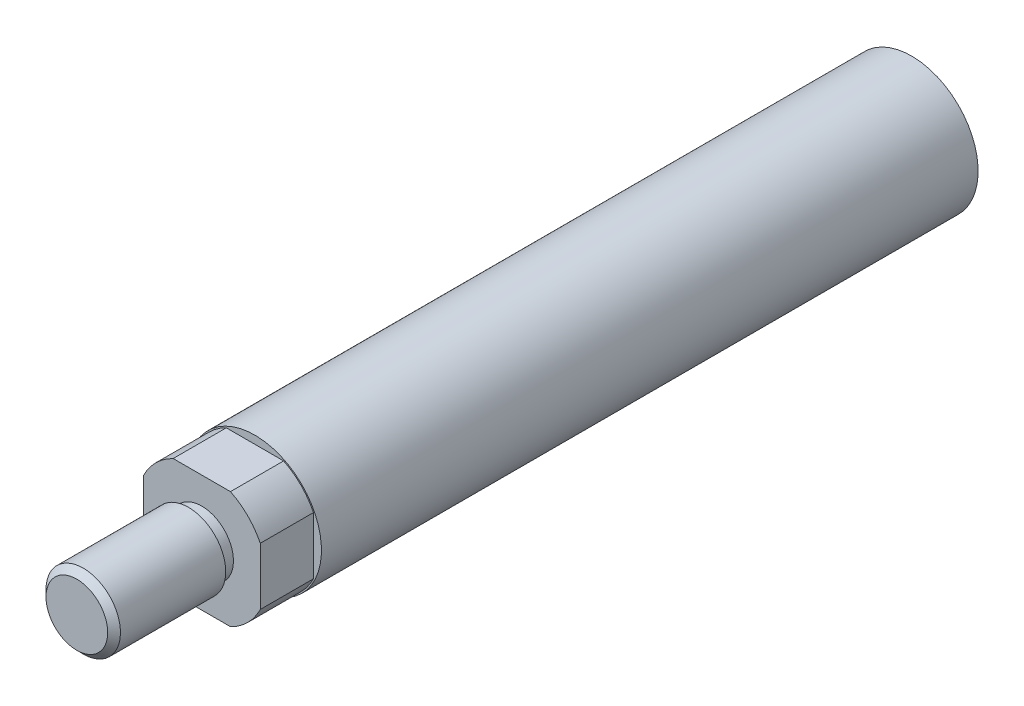
ISO-10303-21;
HEADER;
FILE_DESCRIPTION(('STEP AP214'),'2;1');
FILE_NAME('part.step','',(''),(''),'','','');
FILE_SCHEMA(('AUTOMOTIVE_DESIGN { 1 0 10303 214 1 1 1 1 }'));
ENDSEC;
DATA;
#1=APPLICATION_CONTEXT('core data for automotive mechanical design processes');
#2=APPLICATION_PROTOCOL_DEFINITION('international standard','automotive_design',2000,#1);
#3=PRODUCT_CONTEXT('',#1,'mechanical');
#4=PRODUCT('Part','Part','',(#3));
#5=PRODUCT_RELATED_PRODUCT_CATEGORY('part','',(#4));
#6=PRODUCT_DEFINITION_FORMATION('','',#4);
#7=PRODUCT_DEFINITION_CONTEXT('part definition',#1,'design');
#8=PRODUCT_DEFINITION('design','',#6,#7);
#9=PRODUCT_DEFINITION_SHAPE('','',#8);
#10=(LENGTH_UNIT() NAMED_UNIT(*) SI_UNIT(.MILLI.,.METRE.));
#11=(NAMED_UNIT(*) PLANE_ANGLE_UNIT() SI_UNIT($,.RADIAN.));
#12=(NAMED_UNIT(*) SI_UNIT($,.STERADIAN.) SOLID_ANGLE_UNIT());
#13=UNCERTAINTY_MEASURE_WITH_UNIT(LENGTH_MEASURE(1.E-05),#10,'distance_accuracy_value','');
#14=(GEOMETRIC_REPRESENTATION_CONTEXT(3) GLOBAL_UNCERTAINTY_ASSIGNED_CONTEXT((#13)) GLOBAL_UNIT_ASSIGNED_CONTEXT((#10,
#11,#12)) REPRESENTATION_CONTEXT('',''));
#15=CARTESIAN_POINT('',(0.,0.,0.));
#16=DIRECTION('',(0.,0.,1.));
#17=DIRECTION('',(1.,0.,0.));
#18=AXIS2_PLACEMENT_3D('',#15,#16,#17);
#19=CARTESIAN_POINT('',(0.,0.,181.6));
#20=DIRECTION('',(0.,0.,1.));
#21=DIRECTION('',(1.,0.,0.));
#22=AXIS2_PLACEMENT_3D('',#19,#20,#21);
#23=PLANE('',#22);
#24=CARTESIAN_POINT('',(0.,0.,181.60000000006));
#25=DIRECTION('',(0.,0.,-1.));
#26=DIRECTION('',(-1.,0.,0.));
#27=AXIS2_PLACEMENT_3D('',#24,#25,#26);
#28=CIRCLE('',#27,5.79999999996517);
#29=CARTESIAN_POINT('',(-5.79999999996517,0.,181.60000000006));
#30=VERTEX_POINT('',#29);
#31=EDGE_CURVE('E20',#30,#30,#28,.T.);
#32=ORIENTED_EDGE('',*,*,#31,.F.);
#33=EDGE_LOOP('',(#32));
#34=FACE_BOUND('',#33,.T.);
#35=ADVANCED_FACE('F17',(#34),#23,.T.);
#36=CARTESIAN_POINT('',(0.,0.,180.40000000002));
#37=DIRECTION('',(0.,0.,-1.));
#38=DIRECTION('',(-1.,0.,0.));
#39=AXIS2_PLACEMENT_3D('',#36,#37,#38);
#40=CONICAL_SURFACE('',#39,7.000000000005,0.785398163397448);
#41=ORIENTED_EDGE('',*,*,#31,.T.);
#42=EDGE_LOOP('',(#41));
#43=FACE_BOUND('',#42,.T.);
#44=CARTESIAN_POINT('',(0.,0.,180.4));
#45=DIRECTION('',(0.,0.,-1.));
#46=DIRECTION('',(-1.,0.,0.));
#47=AXIS2_PLACEMENT_3D('',#44,#45,#46);
#48=CIRCLE('',#47,7.);
#49=CARTESIAN_POINT('',(-7.,0.,180.4));
#50=VERTEX_POINT('',#49);
#51=EDGE_CURVE('E111',#50,#50,#48,.T.);
#52=ORIENTED_EDGE('',*,*,#51,.F.);
#53=EDGE_LOOP('',(#52));
#54=FACE_BOUND('',#53,.T.);
#55=ADVANCED_FACE('F158',(#43,#54),#40,.T.);
#56=CARTESIAN_POINT('',(0.,0.,181.6));
#57=DIRECTION('',(0.,0.,-1.));
#58=DIRECTION('',(-1.,0.,0.));
#59=AXIS2_PLACEMENT_3D('',#56,#57,#58);
#60=CYLINDRICAL_SURFACE('',#59,7.);
#61=ORIENTED_EDGE('',*,*,#51,.T.);
#62=EDGE_LOOP('',(#61));
#63=FACE_BOUND('',#62,.T.);
#64=CARTESIAN_POINT('',(0.,0.,160.6));
#65=DIRECTION('',(0.,0.,-1.));
#66=DIRECTION('',(-1.,0.,0.));
#67=AXIS2_PLACEMENT_3D('',#64,#65,#66);
#68=CIRCLE('',#67,7.);
#69=CARTESIAN_POINT('',(-7.,0.,160.6));
#70=VERTEX_POINT('',#69);
#71=EDGE_CURVE('E113',#70,#70,#68,.F.);
#72=ORIENTED_EDGE('',*,*,#71,.T.);
#73=EDGE_LOOP('',(#72));
#74=FACE_BOUND('',#73,.T.);
#75=ADVANCED_FACE('F144',(#63,#74),#60,.T.);
#76=CARTESIAN_POINT('',(0.,0.,160.6));
#77=DIRECTION('',(0.,0.,1.));
#78=DIRECTION('',(1.,0.,0.));
#79=AXIS2_PLACEMENT_3D('',#76,#77,#78);
#80=PLANE('',#79);
#81=CARTESIAN_POINT('',(0.,0.,160.6));
#82=DIRECTION('',(0.,0.,-1.));
#83=DIRECTION('',(-1.,0.,0.));
#84=AXIS2_PLACEMENT_3D('',#81,#82,#83);
#85=CIRCLE('',#84,5.95);
#86=CARTESIAN_POINT('',(-5.95,0.,160.6));
#87=VERTEX_POINT('',#86);
#88=EDGE_CURVE('E139',#87,#87,#85,.T.);
#89=ORIENTED_EDGE('',*,*,#88,.F.);
#90=EDGE_LOOP('',(#89));
#91=FACE_BOUND('',#90,.T.);
#92=ORIENTED_EDGE('',*,*,#71,.F.);
#93=EDGE_LOOP('',(#92));
#94=FACE_BOUND('',#93,.T.);
#95=ADVANCED_FACE('F146',(#91,#94),#80,.F.);
#96=CARTESIAN_POINT('',(0.,0.,160.6));
#97=DIRECTION('',(0.,0.,-1.));
#98=DIRECTION('',(-1.,0.,0.));
#99=AXIS2_PLACEMENT_3D('',#96,#97,#98);
#100=CYLINDRICAL_SURFACE('',#99,5.95);
#101=CARTESIAN_POINT('',(0.,0.,158.1));
#102=DIRECTION('',(0.,0.,-1.));
#103=DIRECTION('',(-1.,0.,0.));
#104=AXIS2_PLACEMENT_3D('',#101,#102,#103);
#105=CIRCLE('',#104,5.95);
#106=CARTESIAN_POINT('',(-5.95,0.,158.1));
#107=VERTEX_POINT('',#106);
#108=EDGE_CURVE('E91',#107,#107,#105,.T.);
#109=ORIENTED_EDGE('',*,*,#108,.F.);
#110=EDGE_LOOP('',(#109));
#111=FACE_BOUND('',#110,.T.);
#112=ORIENTED_EDGE('',*,*,#88,.T.);
#113=EDGE_LOOP('',(#112));
#114=FACE_BOUND('',#113,.T.);
#115=ADVANCED_FACE('F148',(#111,#114),#100,.T.);
#116=CARTESIAN_POINT('',(0.,0.,158.1));
#117=DIRECTION('',(0.,0.,1.));
#118=DIRECTION('',(1.,0.,0.));
#119=AXIS2_PLACEMENT_3D('',#116,#117,#118);
#120=PLANE('',#119);
#121=ORIENTED_EDGE('',*,*,#108,.T.);
#122=EDGE_LOOP('',(#121));
#123=FACE_BOUND('',#122,.T.);
#124=CARTESIAN_POINT('',(0.,0.,158.1));
#125=DIRECTION('',(0.,0.,-1.));
#126=DIRECTION('',(-1.,0.,0.));
#127=AXIS2_PLACEMENT_3D('',#124,#125,#126);
#128=CIRCLE('',#127,12.25);
#129=CARTESIAN_POINT('',(5.39096466321196,11.,158.1));
#130=VERTEX_POINT('',#129);
#131=CARTESIAN_POINT('',(11.,5.39096466321197,158.1));
#132=VERTEX_POINT('',#131);
#133=EDGE_CURVE('E133',#130,#132,#128,.T.);
#134=ORIENTED_EDGE('',*,*,#133,.F.);
#135=DIRECTION('',(1.,0.,0.));
#136=VECTOR('',#135,1.);
#137=CARTESIAN_POINT('',(-5.39096466321196,11.,158.1));
#138=LINE('',#137,#136);
#139=CARTESIAN_POINT('',(-5.39096466321196,11.,158.1));
#140=VERTEX_POINT('',#139);
#141=EDGE_CURVE('E132',#130,#140,#138,.F.);
#142=ORIENTED_EDGE('',*,*,#141,.T.);
#143=CARTESIAN_POINT('',(0.,0.,158.1));
#144=DIRECTION('',(0.,0.,-1.));
#145=DIRECTION('',(-1.,0.,0.));
#146=AXIS2_PLACEMENT_3D('',#143,#144,#145);
#147=CIRCLE('',#146,12.25);
#148=CARTESIAN_POINT('',(-11.,5.39096466321197,158.1));
#149=VERTEX_POINT('',#148);
#150=EDGE_CURVE('E128',#149,#140,#147,.T.);
#151=ORIENTED_EDGE('',*,*,#150,.F.);
#152=DIRECTION('',(0.,1.,0.));
#153=VECTOR('',#152,1.);
#154=CARTESIAN_POINT('',(-11.,5.39096466321196,158.1));
#155=LINE('',#154,#153);
#156=CARTESIAN_POINT('',(-11.,-5.39096466321197,158.1));
#157=VERTEX_POINT('',#156);
#158=EDGE_CURVE('E87',#149,#157,#155,.F.);
#159=ORIENTED_EDGE('',*,*,#158,.T.);
#160=CARTESIAN_POINT('',(0.,0.,158.1));
#161=DIRECTION('',(0.,0.,-1.));
#162=DIRECTION('',(-1.,0.,0.));
#163=AXIS2_PLACEMENT_3D('',#160,#161,#162);
#164=CIRCLE('',#163,12.25);
#165=CARTESIAN_POINT('',(-5.39096466321196,-11.,158.1));
#166=VERTEX_POINT('',#165);
#167=EDGE_CURVE('E80',#166,#157,#164,.T.);
#168=ORIENTED_EDGE('',*,*,#167,.F.);
#169=DIRECTION('',(-1.,0.,0.));
#170=VECTOR('',#169,1.);
#171=CARTESIAN_POINT('',(-5.39096466321196,-11.,158.1));
#172=LINE('',#171,#170);
#173=CARTESIAN_POINT('',(5.39096466321196,-11.,158.1));
#174=VERTEX_POINT('',#173);
#175=EDGE_CURVE('E84',#166,#174,#172,.F.);
#176=ORIENTED_EDGE('',*,*,#175,.T.);
#177=CARTESIAN_POINT('',(0.,0.,158.1));
#178=DIRECTION('',(0.,0.,-1.));
#179=DIRECTION('',(-1.,0.,0.));
#180=AXIS2_PLACEMENT_3D('',#177,#178,#179);
#181=CIRCLE('',#180,12.25);
#182=CARTESIAN_POINT('',(11.,-5.39096466321196,158.1));
#183=VERTEX_POINT('',#182);
#184=EDGE_CURVE('E104',#183,#174,#181,.T.);
#185=ORIENTED_EDGE('',*,*,#184,.F.);
#186=DIRECTION('',(0.,-1.,0.));
#187=VECTOR('',#186,1.);
#188=CARTESIAN_POINT('',(11.,-5.39096466321196,158.1));
#189=LINE('',#188,#187);
#190=EDGE_CURVE('E109',#183,#132,#189,.F.);
#191=ORIENTED_EDGE('',*,*,#190,.T.);
#192=EDGE_LOOP('',(#134,#142,#151,#159,#168,#176,#185,#191));
#193=FACE_BOUND('',#192,.T.);
#194=ADVANCED_FACE('F82',(#123,#193),#120,.T.);
#195=CARTESIAN_POINT('',(0.,0.,158.1));
#196=DIRECTION('',(0.,0.,-1.));
#197=DIRECTION('',(-1.,0.,0.));
#198=AXIS2_PLACEMENT_3D('',#195,#196,#197);
#199=CYLINDRICAL_SURFACE('',#198,12.25);
#200=ORIENTED_EDGE('',*,*,#167,.T.);
#201=DIRECTION('',(0.,0.,-1.));
#202=VECTOR('',#201,1.);
#203=CARTESIAN_POINT('',(-11.,-5.39096466321196,158.1));
#204=LINE('',#203,#202);
#205=CARTESIAN_POINT('',(-11.,-5.39096466321196,148.1));
#206=VERTEX_POINT('',#205);
#207=EDGE_CURVE('E127',#157,#206,#204,.T.);
#208=ORIENTED_EDGE('',*,*,#207,.T.);
#209=CARTESIAN_POINT('',(0.,0.,148.1));
#210=DIRECTION('',(0.,0.,-1.));
#211=DIRECTION('',(-1.,0.,0.));
#212=AXIS2_PLACEMENT_3D('',#209,#210,#211);
#213=CIRCLE('',#212,12.25);
#214=CARTESIAN_POINT('',(-5.39096466321196,-11.,148.1));
#215=VERTEX_POINT('',#214);
#216=EDGE_CURVE('E96',#206,#215,#213,.F.);
#217=ORIENTED_EDGE('',*,*,#216,.T.);
#218=DIRECTION('',(0.,0.,1.));
#219=VECTOR('',#218,1.);
#220=CARTESIAN_POINT('',(-5.39096466321196,-11.,158.1));
#221=LINE('',#220,#219);
#222=EDGE_CURVE('E90',#215,#166,#221,.T.);
#223=ORIENTED_EDGE('',*,*,#222,.T.);
#224=EDGE_LOOP('',(#200,#208,#217,#223));
#225=FACE_BOUND('',#224,.T.);
#226=ADVANCED_FACE('F94',(#225),#199,.T.);
#227=CARTESIAN_POINT('',(-5.39096466321196,-11.,158.1));
#228=DIRECTION('',(0.,1.,0.));
#229=DIRECTION('',(-1.,0.,0.));
#230=AXIS2_PLACEMENT_3D('',#227,#228,#229);
#231=PLANE('',#230);
#232=DIRECTION('',(0.,0.,-1.));
#233=VECTOR('',#232,1.);
#234=CARTESIAN_POINT('',(5.39096466321196,-11.,158.1));
#235=LINE('',#234,#233);
#236=CARTESIAN_POINT('',(5.39096466321196,-11.,148.1));
#237=VERTEX_POINT('',#236);
#238=EDGE_CURVE('E102',#174,#237,#235,.T.);
#239=ORIENTED_EDGE('',*,*,#238,.F.);
#240=ORIENTED_EDGE('',*,*,#175,.F.);
#241=ORIENTED_EDGE('',*,*,#222,.F.);
#242=DIRECTION('',(-1.,0.,0.));
#243=VECTOR('',#242,1.);
#244=CARTESIAN_POINT('',(12.5,-11.,148.1));
#245=LINE('',#244,#243);
#246=EDGE_CURVE('E125',#215,#237,#245,.F.);
#247=ORIENTED_EDGE('',*,*,#246,.T.);
#248=EDGE_LOOP('',(#239,#240,#241,#247));
#249=FACE_BOUND('',#248,.T.);
#250=ADVANCED_FACE('F100',(#249),#231,.F.);
#251=CARTESIAN_POINT('',(0.,0.,158.1));
#252=DIRECTION('',(0.,0.,-1.));
#253=DIRECTION('',(-1.,0.,0.));
#254=AXIS2_PLACEMENT_3D('',#251,#252,#253);
#255=CYLINDRICAL_SURFACE('',#254,12.25);
#256=ORIENTED_EDGE('',*,*,#184,.T.);
#257=ORIENTED_EDGE('',*,*,#238,.T.);
#258=CARTESIAN_POINT('',(0.,0.,148.1));
#259=DIRECTION('',(0.,0.,-1.));
#260=DIRECTION('',(-1.,0.,0.));
#261=AXIS2_PLACEMENT_3D('',#258,#259,#260);
#262=CIRCLE('',#261,12.25);
#263=CARTESIAN_POINT('',(11.,-5.39096466321196,148.1));
#264=VERTEX_POINT('',#263);
#265=EDGE_CURVE('E123',#237,#264,#262,.F.);
#266=ORIENTED_EDGE('',*,*,#265,.T.);
#267=DIRECTION('',(0.,0.,1.));
#268=VECTOR('',#267,1.);
#269=CARTESIAN_POINT('',(11.,-5.39096466321196,158.1));
#270=LINE('',#269,#268);
#271=EDGE_CURVE('E325',#264,#183,#270,.T.);
#272=ORIENTED_EDGE('',*,*,#271,.T.);
#273=EDGE_LOOP('',(#256,#257,#266,#272));
#274=FACE_BOUND('',#273,.T.);
#275=ADVANCED_FACE('F196',(#274),#255,.T.);
#276=CARTESIAN_POINT('',(11.,-5.39096466321196,158.1));
#277=DIRECTION('',(-1.,0.,0.));
#278=DIRECTION('',(0.,-1.,0.));
#279=AXIS2_PLACEMENT_3D('',#276,#277,#278);
#280=PLANE('',#279);
#281=DIRECTION('',(0.,0.,-1.));
#282=VECTOR('',#281,1.);
#283=CARTESIAN_POINT('',(11.,5.39096466321197,158.1));
#284=LINE('',#283,#282);
#285=CARTESIAN_POINT('',(11.,5.39096466321197,148.1));
#286=VERTEX_POINT('',#285);
#287=EDGE_CURVE('E135',#132,#286,#284,.T.);
#288=ORIENTED_EDGE('',*,*,#287,.F.);
#289=ORIENTED_EDGE('',*,*,#190,.F.);
#290=ORIENTED_EDGE('',*,*,#271,.F.);
#291=DIRECTION('',(0.,1.,0.));
#292=VECTOR('',#291,1.);
#293=CARTESIAN_POINT('',(11.,-12.5,148.1));
#294=LINE('',#293,#292);
#295=EDGE_CURVE('E122',#264,#286,#294,.T.);
#296=ORIENTED_EDGE('',*,*,#295,.T.);
#297=EDGE_LOOP('',(#288,#289,#290,#296));
#298=FACE_BOUND('',#297,.T.);
#299=ADVANCED_FACE('F192',(#298),#280,.F.);
#300=CARTESIAN_POINT('',(0.,0.,158.1));
#301=DIRECTION('',(0.,0.,-1.));
#302=DIRECTION('',(-1.,0.,0.));
#303=AXIS2_PLACEMENT_3D('',#300,#301,#302);
#304=CYLINDRICAL_SURFACE('',#303,12.25);
#305=ORIENTED_EDGE('',*,*,#133,.T.);
#306=ORIENTED_EDGE('',*,*,#287,.T.);
#307=CARTESIAN_POINT('',(0.,0.,148.1));
#308=DIRECTION('',(0.,0.,-1.));
#309=DIRECTION('',(-1.,0.,0.));
#310=AXIS2_PLACEMENT_3D('',#307,#308,#309);
#311=CIRCLE('',#310,12.25);
#312=CARTESIAN_POINT('',(5.39096466321196,11.,148.1));
#313=VERTEX_POINT('',#312);
#314=EDGE_CURVE('E120',#286,#313,#311,.F.);
#315=ORIENTED_EDGE('',*,*,#314,.T.);
#316=DIRECTION('',(0.,0.,1.));
#317=VECTOR('',#316,1.);
#318=CARTESIAN_POINT('',(5.39096466321196,11.,158.1));
#319=LINE('',#318,#317);
#320=EDGE_CURVE('E332',#313,#130,#319,.T.);
#321=ORIENTED_EDGE('',*,*,#320,.T.);
#322=EDGE_LOOP('',(#305,#306,#315,#321));
#323=FACE_BOUND('',#322,.T.);
#324=ADVANCED_FACE('F188',(#323),#304,.T.);
#325=CARTESIAN_POINT('',(-5.39096466321196,11.,158.1));
#326=DIRECTION('',(0.,-1.,0.));
#327=DIRECTION('',(1.,0.,0.));
#328=AXIS2_PLACEMENT_3D('',#325,#326,#327);
#329=PLANE('',#328);
#330=DIRECTION('',(0.,0.,-1.));
#331=VECTOR('',#330,1.);
#332=CARTESIAN_POINT('',(-5.39096466321196,11.,158.1));
#333=LINE('',#332,#331);
#334=CARTESIAN_POINT('',(-5.39096466321196,11.,148.1));
#335=VERTEX_POINT('',#334);
#336=EDGE_CURVE('E131',#140,#335,#333,.T.);
#337=ORIENTED_EDGE('',*,*,#336,.F.);
#338=ORIENTED_EDGE('',*,*,#141,.F.);
#339=ORIENTED_EDGE('',*,*,#320,.F.);
#340=DIRECTION('',(-1.,0.,0.));
#341=VECTOR('',#340,1.);
#342=CARTESIAN_POINT('',(12.5,11.,148.1));
#343=LINE('',#342,#341);
#344=EDGE_CURVE('E119',#313,#335,#343,.T.);
#345=ORIENTED_EDGE('',*,*,#344,.T.);
#346=EDGE_LOOP('',(#337,#338,#339,#345));
#347=FACE_BOUND('',#346,.T.);
#348=ADVANCED_FACE('F185',(#347),#329,.F.);
#349=CARTESIAN_POINT('',(0.,0.,158.1));
#350=DIRECTION('',(0.,0.,-1.));
#351=DIRECTION('',(-1.,0.,0.));
#352=AXIS2_PLACEMENT_3D('',#349,#350,#351);
#353=CYLINDRICAL_SURFACE('',#352,12.25);
#354=ORIENTED_EDGE('',*,*,#150,.T.);
#355=ORIENTED_EDGE('',*,*,#336,.T.);
#356=CARTESIAN_POINT('',(0.,0.,148.1));
#357=DIRECTION('',(0.,0.,-1.));
#358=DIRECTION('',(-1.,0.,0.));
#359=AXIS2_PLACEMENT_3D('',#356,#357,#358);
#360=CIRCLE('',#359,12.25);
#361=CARTESIAN_POINT('',(-11.,5.39096466321196,148.1));
#362=VERTEX_POINT('',#361);
#363=EDGE_CURVE('E35',#335,#362,#360,.F.);
#364=ORIENTED_EDGE('',*,*,#363,.T.);
#365=DIRECTION('',(0.,0.,-1.));
#366=VECTOR('',#365,1.);
#367=CARTESIAN_POINT('',(-11.,5.39096466321196,158.1));
#368=LINE('',#367,#366);
#369=EDGE_CURVE('E340',#362,#149,#368,.F.);
#370=ORIENTED_EDGE('',*,*,#369,.T.);
#371=EDGE_LOOP('',(#354,#355,#364,#370));
#372=FACE_BOUND('',#371,.T.);
#373=ADVANCED_FACE('F181',(#372),#353,.T.);
#374=CARTESIAN_POINT('',(-11.,5.39096466321196,158.1));
#375=DIRECTION('',(1.,0.,0.));
#376=DIRECTION('',(0.,0.,-1.));
#377=AXIS2_PLACEMENT_3D('',#374,#375,#376);
#378=PLANE('',#377);
#379=ORIENTED_EDGE('',*,*,#207,.F.);
#380=ORIENTED_EDGE('',*,*,#158,.F.);
#381=ORIENTED_EDGE('',*,*,#369,.F.);
#382=DIRECTION('',(0.,1.,0.));
#383=VECTOR('',#382,1.);
#384=CARTESIAN_POINT('',(-11.,-12.5,148.1));
#385=LINE('',#384,#383);
#386=EDGE_CURVE('E117',#362,#206,#385,.F.);
#387=ORIENTED_EDGE('',*,*,#386,.T.);
#388=EDGE_LOOP('',(#379,#380,#381,#387));
#389=FACE_BOUND('',#388,.T.);
#390=ADVANCED_FACE('F177',(#389),#378,.F.);
#391=CARTESIAN_POINT('',(12.5,-12.5,148.1));
#392=DIRECTION('',(0.,0.,-1.));
#393=DIRECTION('',(-1.,0.,0.));
#394=AXIS2_PLACEMENT_3D('',#391,#392,#393);
#395=PLANE('',#394);
#396=ORIENTED_EDGE('',*,*,#363,.F.);
#397=ORIENTED_EDGE('',*,*,#344,.F.);
#398=ORIENTED_EDGE('',*,*,#314,.F.);
#399=ORIENTED_EDGE('',*,*,#295,.F.);
#400=ORIENTED_EDGE('',*,*,#265,.F.);
#401=ORIENTED_EDGE('',*,*,#246,.F.);
#402=ORIENTED_EDGE('',*,*,#216,.F.);
#403=ORIENTED_EDGE('',*,*,#386,.F.);
#404=EDGE_LOOP('',(#396,#397,#398,#399,#400,#401,#402,#403));
#405=FACE_BOUND('',#404,.T.);
#406=CARTESIAN_POINT('',(0.,0.,148.1));
#407=DIRECTION('',(0.,0.,-1.));
#408=DIRECTION('',(-1.,0.,0.));
#409=AXIS2_PLACEMENT_3D('',#406,#407,#408);
#410=CIRCLE('',#409,12.5);
#411=CARTESIAN_POINT('',(-12.5,0.,148.1));
#412=VERTEX_POINT('',#411);
#413=EDGE_CURVE('E26',#412,#412,#410,.T.);
#414=ORIENTED_EDGE('',*,*,#413,.F.);
#415=EDGE_LOOP('',(#414));
#416=FACE_BOUND('',#415,.T.);
#417=ADVANCED_FACE('F170',(#405,#416),#395,.F.);
#418=CARTESIAN_POINT('',(-12.5,-12.5,24.6));
#419=DIRECTION('',(0.,0.,1.));
#420=DIRECTION('',(1.,0.,0.));
#421=AXIS2_PLACEMENT_3D('',#418,#419,#420);
#422=PLANE('',#421);
#423=CARTESIAN_POINT('',(0.,0.,24.6));
#424=DIRECTION('',(0.,0.,-1.));
#425=DIRECTION('',(-1.,0.,0.));
#426=AXIS2_PLACEMENT_3D('',#423,#424,#425);
#427=CIRCLE('',#426,12.5);
#428=CARTESIAN_POINT('',(-12.5,0.,24.6));
#429=VERTEX_POINT('',#428);
#430=EDGE_CURVE('E11',#429,#429,#427,.F.);
#431=ORIENTED_EDGE('',*,*,#430,.F.);
#432=EDGE_LOOP('',(#431));
#433=FACE_BOUND('',#432,.T.);
#434=ADVANCED_FACE('F164',(#433),#422,.F.);
#435=CARTESIAN_POINT('',(0.,0.,1774.1));
#436=DIRECTION('',(0.,0.,-1.));
#437=DIRECTION('',(-1.,0.,0.));
#438=AXIS2_PLACEMENT_3D('',#435,#436,#437);
#439=CYLINDRICAL_SURFACE('',#438,12.5);
#440=ORIENTED_EDGE('',*,*,#430,.T.);
#441=EDGE_LOOP('',(#440));
#442=FACE_BOUND('',#441,.T.);
#443=ORIENTED_EDGE('',*,*,#413,.T.);
#444=EDGE_LOOP('',(#443));
#445=FACE_BOUND('',#444,.T.);
#446=ADVANCED_FACE('F162',(#442,#445),#439,.T.);
#447=CLOSED_SHELL('',(#35,#55,#75,#95,#115,#194,#226,#250,#275,#299,#324,#348,#373,#390,#417,
#434,#446));
#448=MANIFOLD_SOLID_BREP('B1',#447);
#449=ADVANCED_BREP_SHAPE_REPRESENTATION('',(#18,#448),#14);
#450=SHAPE_DEFINITION_REPRESENTATION(#9,#449);
ENDSEC;
END-ISO-10303-21;
